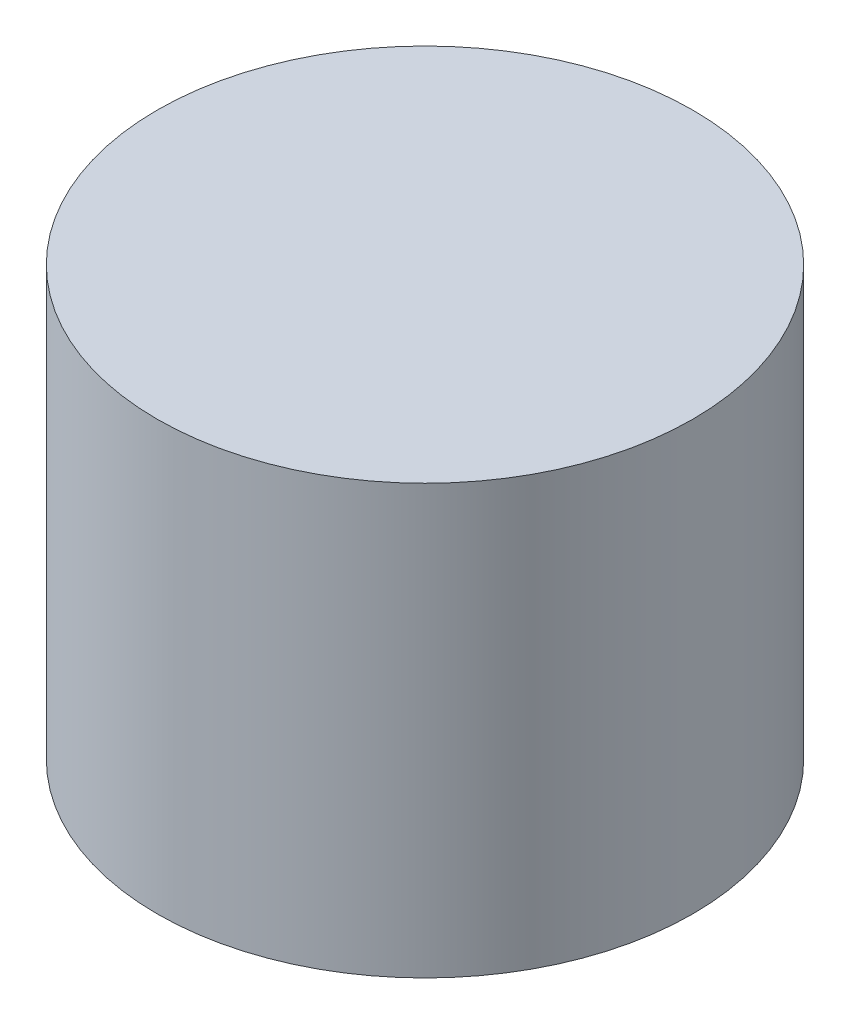
ISO-10303-21;
HEADER;
FILE_DESCRIPTION(('STEP AP214'),'2;1');
FILE_NAME('part.step','',(''),(''),'','','');
FILE_SCHEMA(('AUTOMOTIVE_DESIGN { 1 0 10303 214 1 1 1 1 }'));
ENDSEC;
DATA;
#1=APPLICATION_CONTEXT('core data for automotive mechanical design processes');
#2=APPLICATION_PROTOCOL_DEFINITION('international standard','automotive_design',2000,#1);
#3=PRODUCT_CONTEXT('',#1,'mechanical');
#4=PRODUCT('Part','Part','',(#3));
#5=PRODUCT_RELATED_PRODUCT_CATEGORY('part','',(#4));
#6=PRODUCT_DEFINITION_FORMATION('','',#4);
#7=PRODUCT_DEFINITION_CONTEXT('part definition',#1,'design');
#8=PRODUCT_DEFINITION('design','',#6,#7);
#9=PRODUCT_DEFINITION_SHAPE('','',#8);
#10=(LENGTH_UNIT() NAMED_UNIT(*) SI_UNIT(.MILLI.,.METRE.));
#11=(NAMED_UNIT(*) PLANE_ANGLE_UNIT() SI_UNIT($,.RADIAN.));
#12=(NAMED_UNIT(*) SI_UNIT($,.STERADIAN.) SOLID_ANGLE_UNIT());
#13=UNCERTAINTY_MEASURE_WITH_UNIT(LENGTH_MEASURE(1.E-05),#10,'distance_accuracy_value','');
#14=(GEOMETRIC_REPRESENTATION_CONTEXT(3) GLOBAL_UNCERTAINTY_ASSIGNED_CONTEXT((#13)) GLOBAL_UNIT_ASSIGNED_CONTEXT((#10,
#11,#12)) REPRESENTATION_CONTEXT('',''));
#15=CARTESIAN_POINT('',(0.,0.,0.));
#16=DIRECTION('',(0.,0.,1.));
#17=DIRECTION('',(1.,0.,0.));
#18=AXIS2_PLACEMENT_3D('',#15,#16,#17);
#19=CARTESIAN_POINT('',(-12.6670080957129,20.,5.85571477754353));
#20=DIRECTION('',(0.,-1.,0.));
#21=DIRECTION('',(0.,0.,-1.));
#22=AXIS2_PLACEMENT_3D('',#19,#20,#21);
#23=CYLINDRICAL_SURFACE('',#22,12.5);
#24=CARTESIAN_POINT('',(-12.6670080957129,20.,5.85571477754353));
#25=DIRECTION('',(0.,1.,0.));
#26=DIRECTION('',(0.,0.,1.));
#27=AXIS2_PLACEMENT_3D('',#24,#25,#26);
#28=CIRCLE('',#27,12.5);
#29=CARTESIAN_POINT('',(-12.6670080957129,20.,18.3557147775435));
#30=VERTEX_POINT('',#29);
#31=EDGE_CURVE('E10',#30,#30,#28,.T.);
#32=ORIENTED_EDGE('',*,*,#31,.F.);
#33=EDGE_LOOP('',(#32));
#34=FACE_BOUND('',#33,.T.);
#35=CARTESIAN_POINT('',(-12.6670080957129,0.,5.85571477754353));
#36=DIRECTION('',(0.,1.,0.));
#37=DIRECTION('',(0.,0.,1.));
#38=AXIS2_PLACEMENT_3D('',#35,#36,#37);
#39=CIRCLE('',#38,12.5);
#40=CARTESIAN_POINT('',(-12.6670080957129,0.,18.3557147775435));
#41=VERTEX_POINT('',#40);
#42=EDGE_CURVE('E34',#41,#41,#39,.T.);
#43=ORIENTED_EDGE('',*,*,#42,.T.);
#44=EDGE_LOOP('',(#43));
#45=FACE_BOUND('',#44,.T.);
#46=ADVANCED_FACE('F31',(#34,#45),#23,.T.);
#47=CARTESIAN_POINT('',(-12.6670080957129,20.,5.85571477754353));
#48=DIRECTION('',(0.,1.,0.));
#49=DIRECTION('',(0.,0.,1.));
#50=AXIS2_PLACEMENT_3D('',#47,#48,#49);
#51=PLANE('',#50);
#52=ORIENTED_EDGE('',*,*,#31,.T.);
#53=EDGE_LOOP('',(#52));
#54=FACE_BOUND('',#53,.T.);
#55=ADVANCED_FACE('F46',(#54),#51,.T.);
#56=CARTESIAN_POINT('',(-12.6670080957129,0.,5.85571477754353));
#57=DIRECTION('',(0.,1.,0.));
#58=DIRECTION('',(0.,0.,1.));
#59=AXIS2_PLACEMENT_3D('',#56,#57,#58);
#60=PLANE('',#59);
#61=ORIENTED_EDGE('',*,*,#42,.F.);
#62=EDGE_LOOP('',(#61));
#63=FACE_BOUND('',#62,.T.);
#64=ADVANCED_FACE('F44',(#63),#60,.F.);
#65=CLOSED_SHELL('',(#46,#55,#64));
#66=MANIFOLD_SOLID_BREP('B2',#65);
#67=ADVANCED_BREP_SHAPE_REPRESENTATION('',(#18,#66),#14);
#68=SHAPE_DEFINITION_REPRESENTATION(#9,#67);
ENDSEC;
END-ISO-10303-21;
